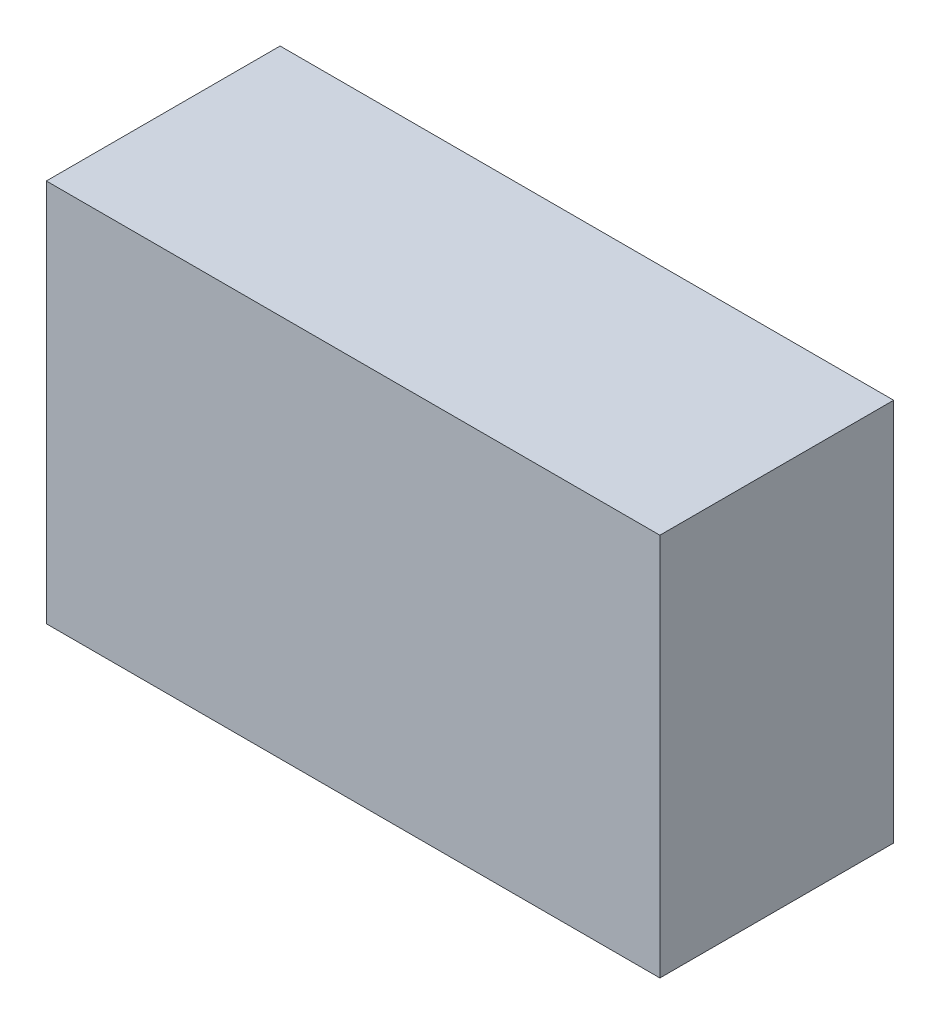
ISO-10303-21;
HEADER;
FILE_DESCRIPTION(('STEP AP214'),'2;1');
FILE_NAME('part.step','',(''),(''),'','','');
FILE_SCHEMA(('AUTOMOTIVE_DESIGN { 1 0 10303 214 1 1 1 1 }'));
ENDSEC;
DATA;
#1=APPLICATION_CONTEXT('core data for automotive mechanical design processes');
#2=APPLICATION_PROTOCOL_DEFINITION('international standard','automotive_design',2000,#1);
#3=PRODUCT_CONTEXT('',#1,'mechanical');
#4=PRODUCT('Part','Part','',(#3));
#5=PRODUCT_RELATED_PRODUCT_CATEGORY('part','',(#4));
#6=PRODUCT_DEFINITION_FORMATION('','',#4);
#7=PRODUCT_DEFINITION_CONTEXT('part definition',#1,'design');
#8=PRODUCT_DEFINITION('design','',#6,#7);
#9=PRODUCT_DEFINITION_SHAPE('','',#8);
#10=(LENGTH_UNIT() NAMED_UNIT(*) SI_UNIT(.MILLI.,.METRE.));
#11=(NAMED_UNIT(*) PLANE_ANGLE_UNIT() SI_UNIT($,.RADIAN.));
#12=(NAMED_UNIT(*) SI_UNIT($,.STERADIAN.) SOLID_ANGLE_UNIT());
#13=UNCERTAINTY_MEASURE_WITH_UNIT(LENGTH_MEASURE(1.E-05),#10,'distance_accuracy_value','');
#14=(GEOMETRIC_REPRESENTATION_CONTEXT(3) GLOBAL_UNCERTAINTY_ASSIGNED_CONTEXT((#13)) GLOBAL_UNIT_ASSIGNED_CONTEXT((#10,
#11,#12)) REPRESENTATION_CONTEXT('',''));
#15=CARTESIAN_POINT('',(0.,0.,0.));
#16=DIRECTION('',(0.,0.,1.));
#17=DIRECTION('',(1.,0.,0.));
#18=AXIS2_PLACEMENT_3D('',#15,#16,#17);
#19=CARTESIAN_POINT('',(-1.,-0.625006350013,0.762001524003));
#20=DIRECTION('',(0.,0.,1.));
#21=DIRECTION('',(1.,0.,0.));
#22=AXIS2_PLACEMENT_3D('',#19,#20,#21);
#23=PLANE('',#22);
#24=DIRECTION('',(0.,-1.,0.));
#25=VECTOR('',#24,1.);
#26=CARTESIAN_POINT('',(1.,0.,0.762001524003));
#27=LINE('',#26,#25);
#28=CARTESIAN_POINT('',(1.,0.625006350013,0.762001524003));
#29=VERTEX_POINT('',#28);
#30=CARTESIAN_POINT('',(1.,-0.625006350013,0.762001524003));
#31=VERTEX_POINT('',#30);
#32=EDGE_CURVE('E77',#29,#31,#27,.T.);
#33=ORIENTED_EDGE('',*,*,#32,.F.);
#34=DIRECTION('',(1.,0.,0.));
#35=VECTOR('',#34,1.);
#36=CARTESIAN_POINT('',(0.,0.625006350013,0.762001524003));
#37=LINE('',#36,#35);
#38=CARTESIAN_POINT('',(-1.,0.625006350013,0.762001524003));
#39=VERTEX_POINT('',#38);
#40=EDGE_CURVE('E59',#39,#29,#37,.T.);
#41=ORIENTED_EDGE('',*,*,#40,.F.);
#42=DIRECTION('',(0.,-1.,0.));
#43=VECTOR('',#42,1.);
#44=CARTESIAN_POINT('',(-1.,0.,0.762001524003));
#45=LINE('',#44,#43);
#46=CARTESIAN_POINT('',(-1.,-0.625006350013,0.762001524003));
#47=VERTEX_POINT('',#46);
#48=EDGE_CURVE('E21',#39,#47,#45,.T.);
#49=ORIENTED_EDGE('',*,*,#48,.T.);
#50=DIRECTION('',(1.,0.,0.));
#51=VECTOR('',#50,1.);
#52=CARTESIAN_POINT('',(0.,-0.625006350013,0.762001524003));
#53=LINE('',#52,#51);
#54=EDGE_CURVE('E56',#47,#31,#53,.T.);
#55=ORIENTED_EDGE('',*,*,#54,.T.);
#56=EDGE_LOOP('',(#33,#41,#49,#55));
#57=FACE_BOUND('',#56,.T.);
#58=ADVANCED_FACE('F17',(#57),#23,.T.);
#59=CARTESIAN_POINT('',(-1.,0.625006350013,0.));
#60=DIRECTION('',(1.,0.,0.));
#61=DIRECTION('',(0.,0.,1.));
#62=AXIS2_PLACEMENT_3D('',#59,#60,#61);
#63=PLANE('',#62);
#64=DIRECTION('',(0.,0.,1.));
#65=VECTOR('',#64,1.);
#66=CARTESIAN_POINT('',(-1.,0.625006350013,0.3810007620015));
#67=LINE('',#66,#65);
#68=CARTESIAN_POINT('',(-1.,0.625006350013,0.));
#69=VERTEX_POINT('',#68);
#70=EDGE_CURVE('E79',#69,#39,#67,.T.);
#71=ORIENTED_EDGE('',*,*,#70,.F.);
#72=DIRECTION('',(0.,-1.,0.));
#73=VECTOR('',#72,1.);
#74=CARTESIAN_POINT('',(-1.,0.,0.));
#75=LINE('',#74,#73);
#76=CARTESIAN_POINT('',(-1.,-0.625006350013,0.));
#77=VERTEX_POINT('',#76);
#78=EDGE_CURVE('E74',#69,#77,#75,.T.);
#79=ORIENTED_EDGE('',*,*,#78,.T.);
#80=DIRECTION('',(0.,0.,1.));
#81=VECTOR('',#80,1.);
#82=CARTESIAN_POINT('',(-1.,-0.625006350013,0.3810007620015));
#83=LINE('',#82,#81);
#84=EDGE_CURVE('E64',#77,#47,#83,.T.);
#85=ORIENTED_EDGE('',*,*,#84,.T.);
#86=ORIENTED_EDGE('',*,*,#48,.F.);
#87=EDGE_LOOP('',(#71,#79,#85,#86));
#88=FACE_BOUND('',#87,.T.);
#89=ADVANCED_FACE('F73',(#88),#63,.F.);
#90=CARTESIAN_POINT('',(-1.,-0.625006350013,0.));
#91=DIRECTION('',(0.,1.,0.));
#92=DIRECTION('',(0.,0.,1.));
#93=AXIS2_PLACEMENT_3D('',#90,#91,#92);
#94=PLANE('',#93);
#95=ORIENTED_EDGE('',*,*,#54,.F.);
#96=ORIENTED_EDGE('',*,*,#84,.F.);
#97=DIRECTION('',(1.,0.,0.));
#98=VECTOR('',#97,1.);
#99=CARTESIAN_POINT('',(0.,-0.625006350013,0.));
#100=LINE('',#99,#98);
#101=CARTESIAN_POINT('',(1.,-0.625006350013,0.));
#102=VERTEX_POINT('',#101);
#103=EDGE_CURVE('E84',#77,#102,#100,.T.);
#104=ORIENTED_EDGE('',*,*,#103,.T.);
#105=DIRECTION('',(0.,0.,-1.));
#106=VECTOR('',#105,1.);
#107=CARTESIAN_POINT('',(1.,-0.625006350013,0.3810007620015));
#108=LINE('',#107,#106);
#109=EDGE_CURVE('E70',#31,#102,#108,.T.);
#110=ORIENTED_EDGE('',*,*,#109,.F.);
#111=EDGE_LOOP('',(#95,#96,#104,#110));
#112=FACE_BOUND('',#111,.T.);
#113=ADVANCED_FACE('F67',(#112),#94,.F.);
#114=CARTESIAN_POINT('',(1.,0.625006350013,0.));
#115=DIRECTION('',(1.,0.,0.));
#116=DIRECTION('',(0.,0.,1.));
#117=AXIS2_PLACEMENT_3D('',#114,#115,#116);
#118=PLANE('',#117);
#119=DIRECTION('',(0.,0.,-1.));
#120=VECTOR('',#119,1.);
#121=CARTESIAN_POINT('',(1.,0.625006350013,0.3810007620015));
#122=LINE('',#121,#120);
#123=CARTESIAN_POINT('',(1.,0.625006350013,0.));
#124=VERTEX_POINT('',#123);
#125=EDGE_CURVE('E35',#29,#124,#122,.T.);
#126=ORIENTED_EDGE('',*,*,#125,.F.);
#127=ORIENTED_EDGE('',*,*,#32,.T.);
#128=ORIENTED_EDGE('',*,*,#109,.T.);
#129=DIRECTION('',(0.,1.,0.));
#130=VECTOR('',#129,1.);
#131=CARTESIAN_POINT('',(1.,0.,0.));
#132=LINE('',#131,#130);
#133=EDGE_CURVE('E27',#102,#124,#132,.T.);
#134=ORIENTED_EDGE('',*,*,#133,.T.);
#135=EDGE_LOOP('',(#126,#127,#128,#134));
#136=FACE_BOUND('',#135,.T.);
#137=ADVANCED_FACE('F89',(#136),#118,.T.);
#138=CARTESIAN_POINT('',(-1.,0.625006350013,0.));
#139=DIRECTION('',(0.,1.,0.));
#140=DIRECTION('',(0.,0.,1.));
#141=AXIS2_PLACEMENT_3D('',#138,#139,#140);
#142=PLANE('',#141);
#143=ORIENTED_EDGE('',*,*,#40,.T.);
#144=ORIENTED_EDGE('',*,*,#125,.T.);
#145=DIRECTION('',(-1.,0.,0.));
#146=VECTOR('',#145,1.);
#147=CARTESIAN_POINT('',(0.,0.625006350013,0.));
#148=LINE('',#147,#146);
#149=EDGE_CURVE('E11',#124,#69,#148,.T.);
#150=ORIENTED_EDGE('',*,*,#149,.T.);
#151=ORIENTED_EDGE('',*,*,#70,.T.);
#152=EDGE_LOOP('',(#143,#144,#150,#151));
#153=FACE_BOUND('',#152,.T.);
#154=ADVANCED_FACE('F91',(#153),#142,.T.);
#155=CARTESIAN_POINT('',(-1.,-0.625006350013,0.));
#156=DIRECTION('',(0.,0.,1.));
#157=DIRECTION('',(1.,0.,0.));
#158=AXIS2_PLACEMENT_3D('',#155,#156,#157);
#159=PLANE('',#158);
#160=ORIENTED_EDGE('',*,*,#133,.F.);
#161=ORIENTED_EDGE('',*,*,#103,.F.);
#162=ORIENTED_EDGE('',*,*,#78,.F.);
#163=ORIENTED_EDGE('',*,*,#149,.F.);
#164=EDGE_LOOP('',(#160,#161,#162,#163));
#165=FACE_BOUND('',#164,.T.);
#166=ADVANCED_FACE('F19',(#165),#159,.F.);
#167=CLOSED_SHELL('',(#58,#89,#113,#137,#154,#166));
#168=MANIFOLD_SOLID_BREP('B1',#167);
#169=ADVANCED_BREP_SHAPE_REPRESENTATION('',(#18,#168),#14);
#170=SHAPE_DEFINITION_REPRESENTATION(#9,#169);
ENDSEC;
END-ISO-10303-21;
